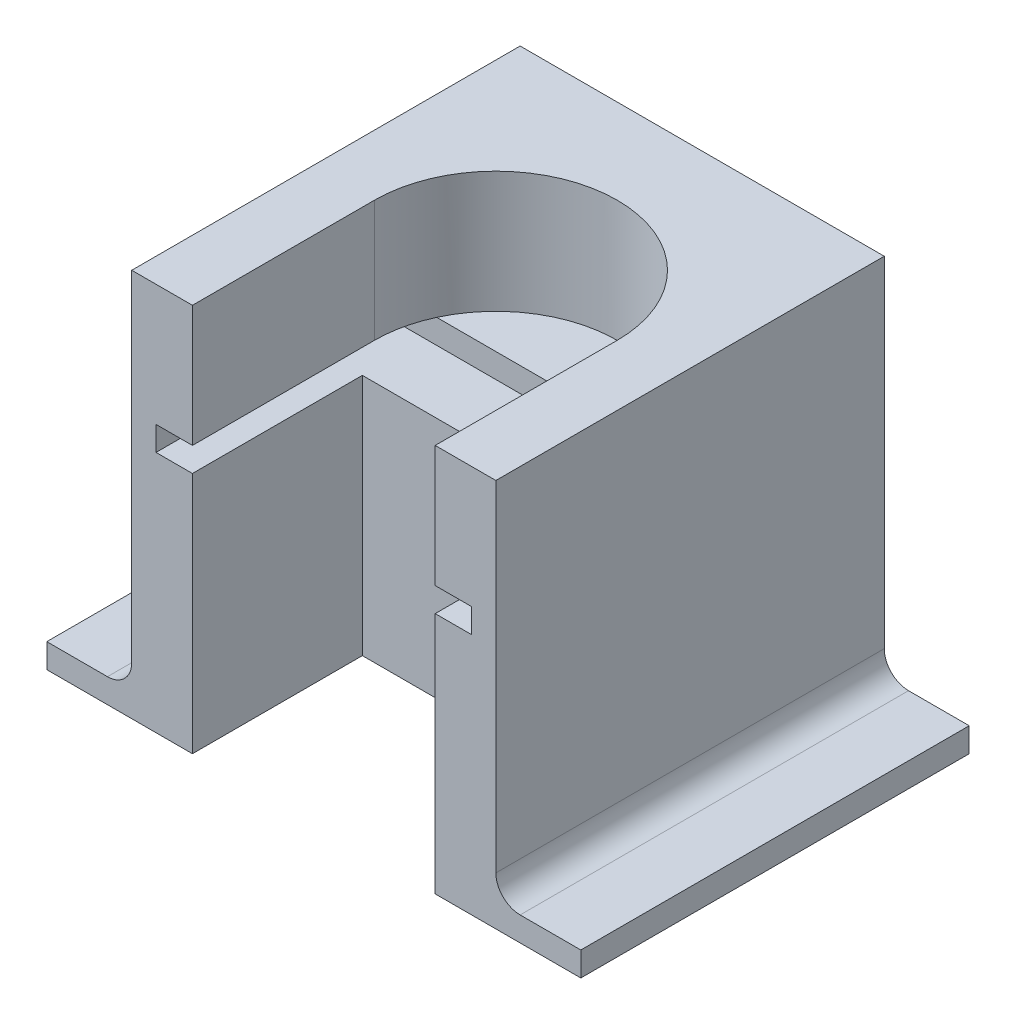
ISO-10303-21;
HEADER;
FILE_DESCRIPTION(('STEP AP214'),'2;1');
FILE_NAME('part.step','',(''),(''),'','','');
FILE_SCHEMA(('AUTOMOTIVE_DESIGN { 1 0 10303 214 1 1 1 1 }'));
ENDSEC;
DATA;
#1=APPLICATION_CONTEXT('core data for automotive mechanical design processes');
#2=APPLICATION_PROTOCOL_DEFINITION('international standard','automotive_design',2000,#1);
#3=PRODUCT_CONTEXT('',#1,'mechanical');
#4=PRODUCT('Part','Part','',(#3));
#5=PRODUCT_RELATED_PRODUCT_CATEGORY('part','',(#4));
#6=PRODUCT_DEFINITION_FORMATION('','',#4);
#7=PRODUCT_DEFINITION_CONTEXT('part definition',#1,'design');
#8=PRODUCT_DEFINITION('design','',#6,#7);
#9=PRODUCT_DEFINITION_SHAPE('','',#8);
#10=(LENGTH_UNIT() NAMED_UNIT(*) SI_UNIT(.MILLI.,.METRE.));
#11=(NAMED_UNIT(*) PLANE_ANGLE_UNIT() SI_UNIT($,.RADIAN.));
#12=(NAMED_UNIT(*) SI_UNIT($,.STERADIAN.) SOLID_ANGLE_UNIT());
#13=UNCERTAINTY_MEASURE_WITH_UNIT(LENGTH_MEASURE(1.E-05),#10,'distance_accuracy_value','');
#14=(GEOMETRIC_REPRESENTATION_CONTEXT(3) GLOBAL_UNCERTAINTY_ASSIGNED_CONTEXT((#13)) GLOBAL_UNIT_ASSIGNED_CONTEXT((#10,
#11,#12)) REPRESENTATION_CONTEXT('',''));
#15=CARTESIAN_POINT('',(0.,0.,0.));
#16=DIRECTION('',(0.,0.,1.));
#17=DIRECTION('',(1.,0.,0.));
#18=AXIS2_PLACEMENT_3D('',#15,#16,#17);
#19=CARTESIAN_POINT('',(-4.99999999999999,22.,-28.));
#20=DIRECTION('',(0.,1.,0.));
#21=DIRECTION('',(0.,0.,1.));
#22=AXIS2_PLACEMENT_3D('',#19,#20,#21);
#23=PLANE('',#22);
#24=DIRECTION('',(0.,0.,1.));
#25=VECTOR('',#24,1.);
#26=CARTESIAN_POINT('',(-28.,22.,-28.));
#27=LINE('',#26,#25);
#28=CARTESIAN_POINT('',(-28.,22.,-19.2));
#29=VERTEX_POINT('',#28);
#30=CARTESIAN_POINT('',(-28.,22.,0.));
#31=VERTEX_POINT('',#30);
#32=EDGE_CURVE('E319',#29,#31,#27,.T.);
#33=ORIENTED_EDGE('',*,*,#32,.F.);
#34=DIRECTION('',(1.,0.,0.));
#35=VECTOR('',#34,1.);
#36=CARTESIAN_POINT('',(-1.99999999999999,22.,-19.2));
#37=LINE('',#36,#35);
#38=CARTESIAN_POINT('',(-24.0752410436307,22.,-19.2));
#39=VERTEX_POINT('',#38);
#40=EDGE_CURVE('E235',#29,#39,#37,.T.);
#41=ORIENTED_EDGE('',*,*,#40,.T.);
#42=CARTESIAN_POINT('',(-15.,22.,-15.));
#43=DIRECTION('',(0.,1.,0.));
#44=DIRECTION('',(0.,0.,1.));
#45=AXIS2_PLACEMENT_3D('',#42,#43,#44);
#46=CIRCLE('',#45,9.99999999999999);
#47=CARTESIAN_POINT('',(-25.,22.,-15.));
#48=VERTEX_POINT('',#47);
#49=EDGE_CURVE('E247',#39,#48,#46,.T.);
#50=ORIENTED_EDGE('',*,*,#49,.T.);
#51=DIRECTION('',(0.,0.,1.));
#52=VECTOR('',#51,1.);
#53=CARTESIAN_POINT('',(-25.,22.,-28.));
#54=LINE('',#53,#52);
#55=CARTESIAN_POINT('',(-25.,22.,0.));
#56=VERTEX_POINT('',#55);
#57=EDGE_CURVE('E317',#48,#56,#54,.T.);
#58=ORIENTED_EDGE('',*,*,#57,.T.);
#59=DIRECTION('',(-1.,0.,0.));
#60=VECTOR('',#59,1.);
#61=CARTESIAN_POINT('',(-25.,22.,0.));
#62=LINE('',#61,#60);
#63=EDGE_CURVE('E291',#56,#31,#62,.T.);
#64=ORIENTED_EDGE('',*,*,#63,.T.);
#65=EDGE_LOOP('',(#33,#41,#50,#58,#64));
#66=FACE_BOUND('',#65,.T.);
#67=ADVANCED_FACE('F32',(#66),#23,.F.);
#68=CARTESIAN_POINT('',(-25.,32.,-28.));
#69=DIRECTION('',(-1.,0.,0.));
#70=DIRECTION('',(0.,0.,1.));
#71=AXIS2_PLACEMENT_3D('',#68,#69,#70);
#72=PLANE('',#71);
#73=DIRECTION('',(0.,1.,0.));
#74=VECTOR('',#73,1.);
#75=CARTESIAN_POINT('',(-25.,-1.85372088375312,-15.));
#76=LINE('',#75,#74);
#77=CARTESIAN_POINT('',(-25.,32.,-15.));
#78=VERTEX_POINT('',#77);
#79=EDGE_CURVE('E250',#48,#78,#76,.T.);
#80=ORIENTED_EDGE('',*,*,#79,.T.);
#81=DIRECTION('',(0.,0.,-1.));
#82=VECTOR('',#81,1.);
#83=CARTESIAN_POINT('',(-25.,32.,-28.));
#84=LINE('',#83,#82);
#85=CARTESIAN_POINT('',(-25.,32.,0.));
#86=VERTEX_POINT('',#85);
#87=EDGE_CURVE('E325',#86,#78,#84,.T.);
#88=ORIENTED_EDGE('',*,*,#87,.F.);
#89=DIRECTION('',(0.,-1.,0.));
#90=VECTOR('',#89,1.);
#91=CARTESIAN_POINT('',(-25.,32.,0.));
#92=LINE('',#91,#90);
#93=EDGE_CURVE('E328',#86,#56,#92,.T.);
#94=ORIENTED_EDGE('',*,*,#93,.T.);
#95=ORIENTED_EDGE('',*,*,#57,.F.);
#96=EDGE_LOOP('',(#80,#88,#94,#95));
#97=FACE_BOUND('',#96,.T.);
#98=ADVANCED_FACE('F447',(#97),#72,.F.);
#99=CARTESIAN_POINT('',(-30.,20.,0.));
#100=DIRECTION('',(1.,0.,0.));
#101=DIRECTION('',(0.,0.,-1.));
#102=AXIS2_PLACEMENT_3D('',#99,#100,#101);
#103=PLANE('',#102);
#104=DIRECTION('',(0.,0.,1.));
#105=VECTOR('',#104,1.);
#106=CARTESIAN_POINT('',(-30.,32.,-28.));
#107=LINE('',#106,#105);
#108=CARTESIAN_POINT('',(-30.,32.,-32.));
#109=VERTEX_POINT('',#108);
#110=CARTESIAN_POINT('',(-30.,32.,0.));
#111=VERTEX_POINT('',#110);
#112=EDGE_CURVE('E200',#109,#111,#107,.T.);
#113=ORIENTED_EDGE('',*,*,#112,.F.);
#114=DIRECTION('',(0.,1.,0.));
#115=VECTOR('',#114,1.);
#116=CARTESIAN_POINT('',(-30.,4.,-32.));
#117=LINE('',#116,#115);
#118=CARTESIAN_POINT('',(-30.,4.,-32.));
#119=VERTEX_POINT('',#118);
#120=EDGE_CURVE('E197',#119,#109,#117,.T.);
#121=ORIENTED_EDGE('',*,*,#120,.F.);
#122=DIRECTION('',(0.,0.,-1.));
#123=VECTOR('',#122,1.);
#124=CARTESIAN_POINT('',(-30.,4.,0.));
#125=LINE('',#124,#123);
#126=CARTESIAN_POINT('',(-30.,4.,0.));
#127=VERTEX_POINT('',#126);
#128=EDGE_CURVE('E187',#119,#127,#125,.F.);
#129=ORIENTED_EDGE('',*,*,#128,.T.);
#130=DIRECTION('',(0.,-1.,0.));
#131=VECTOR('',#130,1.);
#132=CARTESIAN_POINT('',(-30.,20.,0.));
#133=LINE('',#132,#131);
#134=EDGE_CURVE('E352',#111,#127,#133,.T.);
#135=ORIENTED_EDGE('',*,*,#134,.F.);
#136=EDGE_LOOP('',(#113,#121,#129,#135));
#137=FACE_BOUND('',#136,.T.);
#138=ADVANCED_FACE('F198',(#137),#103,.F.);
#139=CARTESIAN_POINT('',(0.,20.,0.));
#140=DIRECTION('',(0.,0.,-1.));
#141=DIRECTION('',(-1.,0.,0.));
#142=AXIS2_PLACEMENT_3D('',#139,#140,#141);
#143=PLANE('',#142);
#144=DIRECTION('',(1.,0.,0.));
#145=VECTOR('',#144,1.);
#146=CARTESIAN_POINT('',(0.,20.,0.));
#147=LINE('',#146,#145);
#148=CARTESIAN_POINT('',(-4.99999999999999,20.,0.));
#149=VERTEX_POINT('',#148);
#150=CARTESIAN_POINT('',(-1.99999999999999,20.,0.));
#151=VERTEX_POINT('',#150);
#152=EDGE_CURVE('E346',#149,#151,#147,.T.);
#153=ORIENTED_EDGE('',*,*,#152,.F.);
#154=DIRECTION('',(0.,1.,0.));
#155=VECTOR('',#154,1.);
#156=CARTESIAN_POINT('',(-4.99999999999999,20.,0.));
#157=LINE('',#156,#155);
#158=CARTESIAN_POINT('',(-4.99999999999999,0.,0.));
#159=VERTEX_POINT('',#158);
#160=EDGE_CURVE('E271',#159,#149,#157,.T.);
#161=ORIENTED_EDGE('',*,*,#160,.F.);
#162=DIRECTION('',(1.,0.,0.));
#163=VECTOR('',#162,1.);
#164=CARTESIAN_POINT('',(0.,0.,0.));
#165=LINE('',#164,#163);
#166=CARTESIAN_POINT('',(7.,0.,0.));
#167=VERTEX_POINT('',#166);
#168=EDGE_CURVE('E341',#159,#167,#165,.T.);
#169=ORIENTED_EDGE('',*,*,#168,.T.);
#170=DIRECTION('',(0.,1.,0.));
#171=VECTOR('',#170,1.);
#172=CARTESIAN_POINT('',(7.,0.,0.));
#173=LINE('',#172,#171);
#174=CARTESIAN_POINT('',(7.,1.99999999999999,0.));
#175=VERTEX_POINT('',#174);
#176=EDGE_CURVE('E256',#167,#175,#173,.T.);
#177=ORIENTED_EDGE('',*,*,#176,.T.);
#178=DIRECTION('',(-1.,0.,0.));
#179=VECTOR('',#178,1.);
#180=CARTESIAN_POINT('',(0.,2.,0.));
#181=LINE('',#180,#179);
#182=CARTESIAN_POINT('',(2.,2.,0.));
#183=VERTEX_POINT('',#182);
#184=EDGE_CURVE('E258',#175,#183,#181,.T.);
#185=ORIENTED_EDGE('',*,*,#184,.T.);
#186=CARTESIAN_POINT('',(2.,4.,0.));
#187=DIRECTION('',(0.,0.,-1.));
#188=DIRECTION('',(-1.,0.,0.));
#189=AXIS2_PLACEMENT_3D('',#186,#187,#188);
#190=CIRCLE('',#189,2.);
#191=CARTESIAN_POINT('',(0.,4.,0.));
#192=VERTEX_POINT('',#191);
#193=EDGE_CURVE('E40',#183,#192,#190,.T.);
#194=ORIENTED_EDGE('',*,*,#193,.T.);
#195=DIRECTION('',(0.,-1.,0.));
#196=VECTOR('',#195,1.);
#197=CARTESIAN_POINT('',(0.,20.,0.));
#198=LINE('',#197,#196);
#199=CARTESIAN_POINT('',(0.,32.,0.));
#200=VERTEX_POINT('',#199);
#201=EDGE_CURVE('E345',#200,#192,#198,.T.);
#202=ORIENTED_EDGE('',*,*,#201,.F.);
#203=DIRECTION('',(1.,0.,0.));
#204=VECTOR('',#203,1.);
#205=CARTESIAN_POINT('',(0.,32.,0.));
#206=LINE('',#205,#204);
#207=CARTESIAN_POINT('',(-4.99999999999999,32.,0.));
#208=VERTEX_POINT('',#207);
#209=EDGE_CURVE('E335',#208,#200,#206,.T.);
#210=ORIENTED_EDGE('',*,*,#209,.F.);
#211=DIRECTION('',(0.,-1.,0.));
#212=VECTOR('',#211,1.);
#213=CARTESIAN_POINT('',(-4.99999999999999,32.,0.));
#214=LINE('',#213,#212);
#215=CARTESIAN_POINT('',(-4.99999999999999,22.,0.));
#216=VERTEX_POINT('',#215);
#217=EDGE_CURVE('E338',#208,#216,#214,.T.);
#218=ORIENTED_EDGE('',*,*,#217,.T.);
#219=DIRECTION('',(-1.,0.,0.));
#220=VECTOR('',#219,1.);
#221=CARTESIAN_POINT('',(-4.99999999999999,22.,0.));
#222=LINE('',#221,#220);
#223=CARTESIAN_POINT('',(-1.99999999999999,22.,0.));
#224=VERTEX_POINT('',#223);
#225=EDGE_CURVE('E302',#224,#216,#222,.T.);
#226=ORIENTED_EDGE('',*,*,#225,.F.);
#227=DIRECTION('',(0.,1.,0.));
#228=VECTOR('',#227,1.);
#229=CARTESIAN_POINT('',(-1.99999999999999,20.,0.));
#230=LINE('',#229,#228);
#231=EDGE_CURVE('E299',#151,#224,#230,.T.);
#232=ORIENTED_EDGE('',*,*,#231,.F.);
#233=EDGE_LOOP('',(#153,#161,#169,#177,#185,#194,#202,#210,#218,#226,#232));
#234=FACE_BOUND('',#233,.T.);
#235=ADVANCED_FACE('F361',(#234),#143,.F.);
#236=CARTESIAN_POINT('',(0.,20.,0.));
#237=DIRECTION('',(0.,1.,0.));
#238=DIRECTION('',(0.,0.,1.));
#239=AXIS2_PLACEMENT_3D('',#236,#237,#238);
#240=PLANE('',#239);
#241=DIRECTION('',(-1.,0.,0.));
#242=VECTOR('',#241,1.);
#243=CARTESIAN_POINT('',(-1.99999999999999,20.,-19.2));
#244=LINE('',#243,#242);
#245=CARTESIAN_POINT('',(-1.99999999999999,20.,-19.2));
#246=VERTEX_POINT('',#245);
#247=CARTESIAN_POINT('',(-28.,20.,-19.2));
#248=VERTEX_POINT('',#247);
#249=EDGE_CURVE('E47',#246,#248,#244,.T.);
#250=ORIENTED_EDGE('',*,*,#249,.T.);
#251=DIRECTION('',(0.,0.,1.));
#252=VECTOR('',#251,1.);
#253=CARTESIAN_POINT('',(-28.,20.,-28.));
#254=LINE('',#253,#252);
#255=CARTESIAN_POINT('',(-28.,20.,0.));
#256=VERTEX_POINT('',#255);
#257=EDGE_CURVE('E303',#248,#256,#254,.T.);
#258=ORIENTED_EDGE('',*,*,#257,.T.);
#259=CARTESIAN_POINT('',(-25.,20.,0.));
#260=VERTEX_POINT('',#259);
#261=EDGE_CURVE('E342',#256,#260,#147,.T.);
#262=ORIENTED_EDGE('',*,*,#261,.T.);
#263=DIRECTION('',(0.,0.,1.));
#264=VECTOR('',#263,1.);
#265=CARTESIAN_POINT('',(-25.,20.,-14.));
#266=LINE('',#265,#264);
#267=CARTESIAN_POINT('',(-25.,20.,-14.));
#268=VERTEX_POINT('',#267);
#269=EDGE_CURVE('E295',#268,#260,#266,.T.);
#270=ORIENTED_EDGE('',*,*,#269,.F.);
#271=DIRECTION('',(-1.,0.,0.));
#272=VECTOR('',#271,1.);
#273=CARTESIAN_POINT('',(-4.99999999999999,20.,-14.));
#274=LINE('',#273,#272);
#275=CARTESIAN_POINT('',(-4.99999999999999,20.,-14.));
#276=VERTEX_POINT('',#275);
#277=EDGE_CURVE('E277',#276,#268,#274,.T.);
#278=ORIENTED_EDGE('',*,*,#277,.F.);
#279=DIRECTION('',(0.,0.,1.));
#280=VECTOR('',#279,1.);
#281=CARTESIAN_POINT('',(-4.99999999999999,20.,-14.));
#282=LINE('',#281,#280);
#283=EDGE_CURVE('E286',#276,#149,#282,.T.);
#284=ORIENTED_EDGE('',*,*,#283,.T.);
#285=ORIENTED_EDGE('',*,*,#152,.T.);
#286=DIRECTION('',(0.,0.,1.));
#287=VECTOR('',#286,1.);
#288=CARTESIAN_POINT('',(-1.99999999999999,20.,-28.));
#289=LINE('',#288,#287);
#290=EDGE_CURVE('E306',#246,#151,#289,.T.);
#291=ORIENTED_EDGE('',*,*,#290,.F.);
#292=EDGE_LOOP('',(#250,#258,#262,#270,#278,#284,#285,#291));
#293=FACE_BOUND('',#292,.T.);
#294=ADVANCED_FACE('F418',(#293),#240,.T.);
#295=CARTESIAN_POINT('',(0.,20.,0.));
#296=DIRECTION('',(-1.,0.,0.));
#297=DIRECTION('',(0.,0.,1.));
#298=AXIS2_PLACEMENT_3D('',#295,#296,#297);
#299=PLANE('',#298);
#300=ORIENTED_EDGE('',*,*,#201,.T.);
#301=DIRECTION('',(0.,0.,-1.));
#302=VECTOR('',#301,1.);
#303=CARTESIAN_POINT('',(0.,4.,0.));
#304=LINE('',#303,#302);
#305=CARTESIAN_POINT('',(0.,4.,-32.));
#306=VERTEX_POINT('',#305);
#307=EDGE_CURVE('E354',#192,#306,#304,.T.);
#308=ORIENTED_EDGE('',*,*,#307,.T.);
#309=DIRECTION('',(0.,-1.,0.));
#310=VECTOR('',#309,1.);
#311=CARTESIAN_POINT('',(0.,32.,-32.));
#312=LINE('',#311,#310);
#313=CARTESIAN_POINT('',(0.,32.,-32.));
#314=VERTEX_POINT('',#313);
#315=EDGE_CURVE('E214',#314,#306,#312,.T.);
#316=ORIENTED_EDGE('',*,*,#315,.F.);
#317=DIRECTION('',(0.,0.,-1.));
#318=VECTOR('',#317,1.);
#319=CARTESIAN_POINT('',(0.,32.,-28.));
#320=LINE('',#319,#318);
#321=EDGE_CURVE('E331',#200,#314,#320,.T.);
#322=ORIENTED_EDGE('',*,*,#321,.F.);
#323=EDGE_LOOP('',(#300,#308,#316,#322));
#324=FACE_BOUND('',#323,.T.);
#325=ADVANCED_FACE('F368',(#324),#299,.F.);
#326=CARTESIAN_POINT('',(-37.,0.,0.));
#327=VERTEX_POINT('',#326);
#328=CARTESIAN_POINT('',(-25.,0.,0.));
#329=VERTEX_POINT('',#328);
#330=EDGE_CURVE('E347',#327,#329,#165,.T.);
#331=ORIENTED_EDGE('',*,*,#330,.T.);
#332=DIRECTION('',(0.,-1.,0.));
#333=VECTOR('',#332,1.);
#334=CARTESIAN_POINT('',(-25.,20.,0.));
#335=LINE('',#334,#333);
#336=EDGE_CURVE('E278',#260,#329,#335,.T.);
#337=ORIENTED_EDGE('',*,*,#336,.F.);
#338=ORIENTED_EDGE('',*,*,#261,.F.);
#339=DIRECTION('',(0.,-1.,0.));
#340=VECTOR('',#339,1.);
#341=CARTESIAN_POINT('',(-28.,20.,0.));
#342=LINE('',#341,#340);
#343=EDGE_CURVE('E314',#31,#256,#342,.T.);
#344=ORIENTED_EDGE('',*,*,#343,.F.);
#345=ORIENTED_EDGE('',*,*,#63,.F.);
#346=ORIENTED_EDGE('',*,*,#93,.F.);
#347=DIRECTION('',(1.,0.,0.));
#348=VECTOR('',#347,1.);
#349=CARTESIAN_POINT('',(-30.,32.,0.));
#350=LINE('',#349,#348);
#351=EDGE_CURVE('E323',#111,#86,#350,.T.);
#352=ORIENTED_EDGE('',*,*,#351,.F.);
#353=ORIENTED_EDGE('',*,*,#134,.T.);
#354=CARTESIAN_POINT('',(-32.,4.,0.));
#355=DIRECTION('',(0.,0.,-1.));
#356=DIRECTION('',(-1.,0.,0.));
#357=AXIS2_PLACEMENT_3D('',#354,#355,#356);
#358=CIRCLE('',#357,2.);
#359=CARTESIAN_POINT('',(-32.,2.,0.));
#360=VERTEX_POINT('',#359);
#361=EDGE_CURVE('E11',#127,#360,#358,.T.);
#362=ORIENTED_EDGE('',*,*,#361,.T.);
#363=DIRECTION('',(-1.,0.,0.));
#364=VECTOR('',#363,1.);
#365=CARTESIAN_POINT('',(-30.,2.,0.));
#366=LINE('',#365,#364);
#367=CARTESIAN_POINT('',(-37.,2.,0.));
#368=VERTEX_POINT('',#367);
#369=EDGE_CURVE('E268',#360,#368,#366,.T.);
#370=ORIENTED_EDGE('',*,*,#369,.T.);
#371=DIRECTION('',(0.,-1.,0.));
#372=VECTOR('',#371,1.);
#373=CARTESIAN_POINT('',(-37.,0.,0.));
#374=LINE('',#373,#372);
#375=EDGE_CURVE('E265',#368,#327,#374,.T.);
#376=ORIENTED_EDGE('',*,*,#375,.T.);
#377=EDGE_LOOP('',(#331,#337,#338,#344,#345,#346,#352,#353,#362,#370,#376));
#378=FACE_BOUND('',#377,.T.);
#379=ADVANCED_FACE('F395',(#378),#143,.F.);
#380=CARTESIAN_POINT('',(0.,0.,0.));
#381=DIRECTION('',(0.,1.,0.));
#382=DIRECTION('',(0.,0.,1.));
#383=AXIS2_PLACEMENT_3D('',#380,#381,#382);
#384=PLANE('',#383);
#385=ORIENTED_EDGE('',*,*,#168,.F.);
#386=DIRECTION('',(0.,0.,1.));
#387=VECTOR('',#386,1.);
#388=CARTESIAN_POINT('',(-4.99999999999999,0.,-14.));
#389=LINE('',#388,#387);
#390=CARTESIAN_POINT('',(-4.99999999999999,0.,-14.));
#391=VERTEX_POINT('',#390);
#392=EDGE_CURVE('E289',#391,#159,#389,.T.);
#393=ORIENTED_EDGE('',*,*,#392,.F.);
#394=DIRECTION('',(1.,0.,0.));
#395=VECTOR('',#394,1.);
#396=CARTESIAN_POINT('',(-4.99999999999999,0.,-14.));
#397=LINE('',#396,#395);
#398=CARTESIAN_POINT('',(-25.,0.,-14.));
#399=VERTEX_POINT('',#398);
#400=EDGE_CURVE('E283',#399,#391,#397,.T.);
#401=ORIENTED_EDGE('',*,*,#400,.F.);
#402=DIRECTION('',(0.,0.,1.));
#403=VECTOR('',#402,1.);
#404=CARTESIAN_POINT('',(-25.,0.,-14.));
#405=LINE('',#404,#403);
#406=EDGE_CURVE('E292',#399,#329,#405,.T.);
#407=ORIENTED_EDGE('',*,*,#406,.T.);
#408=ORIENTED_EDGE('',*,*,#330,.F.);
#409=DIRECTION('',(0.,0.,-1.));
#410=VECTOR('',#409,1.);
#411=CARTESIAN_POINT('',(-37.,0.,7.28010988928053));
#412=LINE('',#411,#410);
#413=CARTESIAN_POINT('',(-37.,0.,-32.));
#414=VERTEX_POINT('',#413);
#415=EDGE_CURVE('E264',#327,#414,#412,.T.);
#416=ORIENTED_EDGE('',*,*,#415,.T.);
#417=DIRECTION('',(-1.,0.,0.));
#418=VECTOR('',#417,1.);
#419=CARTESIAN_POINT('',(6.99999999999999,0.,-32.));
#420=LINE('',#419,#418);
#421=CARTESIAN_POINT('',(6.99999999999999,0.,-32.));
#422=VERTEX_POINT('',#421);
#423=EDGE_CURVE('E226',#422,#414,#420,.T.);
#424=ORIENTED_EDGE('',*,*,#423,.F.);
#425=DIRECTION('',(0.,0.,-1.));
#426=VECTOR('',#425,1.);
#427=CARTESIAN_POINT('',(7.,0.,7.28010988928052));
#428=LINE('',#427,#426);
#429=EDGE_CURVE('E259',#167,#422,#428,.T.);
#430=ORIENTED_EDGE('',*,*,#429,.F.);
#431=EDGE_LOOP('',(#385,#393,#401,#407,#408,#416,#424,#430));
#432=FACE_BOUND('',#431,.T.);
#433=ADVANCED_FACE('F385',(#432),#384,.F.);
#434=CARTESIAN_POINT('',(-5.,32.,-28.));
#435=DIRECTION('',(1.,0.,0.));
#436=DIRECTION('',(0.,0.,-1.));
#437=AXIS2_PLACEMENT_3D('',#434,#435,#436);
#438=PLANE('',#437);
#439=DIRECTION('',(0.,0.,1.));
#440=VECTOR('',#439,1.);
#441=CARTESIAN_POINT('',(-5.,32.,-28.));
#442=LINE('',#441,#440);
#443=CARTESIAN_POINT('',(-5.,32.,-15.));
#444=VERTEX_POINT('',#443);
#445=EDGE_CURVE('E333',#444,#208,#442,.T.);
#446=ORIENTED_EDGE('',*,*,#445,.F.);
#447=DIRECTION('',(0.,1.,0.));
#448=VECTOR('',#447,1.);
#449=CARTESIAN_POINT('',(-5.,-1.85372088375312,-15.));
#450=LINE('',#449,#448);
#451=CARTESIAN_POINT('',(-5.,22.,-15.));
#452=VERTEX_POINT('',#451);
#453=EDGE_CURVE('E251',#452,#444,#450,.T.);
#454=ORIENTED_EDGE('',*,*,#453,.F.);
#455=DIRECTION('',(0.,0.,1.));
#456=VECTOR('',#455,1.);
#457=CARTESIAN_POINT('',(-4.99999999999999,22.,-28.));
#458=LINE('',#457,#456);
#459=EDGE_CURVE('E307',#452,#216,#458,.T.);
#460=ORIENTED_EDGE('',*,*,#459,.T.);
#461=ORIENTED_EDGE('',*,*,#217,.F.);
#462=EDGE_LOOP('',(#446,#454,#460,#461));
#463=FACE_BOUND('',#462,.T.);
#464=ADVANCED_FACE('F406',(#463),#438,.F.);
#465=CARTESIAN_POINT('',(0.,32.,0.));
#466=DIRECTION('',(0.,-1.,0.));
#467=DIRECTION('',(0.,0.,-1.));
#468=AXIS2_PLACEMENT_3D('',#465,#466,#467);
#469=PLANE('',#468);
#470=ORIENTED_EDGE('',*,*,#321,.T.);
#471=DIRECTION('',(1.,0.,0.));
#472=VECTOR('',#471,1.);
#473=CARTESIAN_POINT('',(-30.,32.,-32.));
#474=LINE('',#473,#472);
#475=EDGE_CURVE('E204',#109,#314,#474,.T.);
#476=ORIENTED_EDGE('',*,*,#475,.F.);
#477=ORIENTED_EDGE('',*,*,#112,.T.);
#478=ORIENTED_EDGE('',*,*,#351,.T.);
#479=ORIENTED_EDGE('',*,*,#87,.T.);
#480=CARTESIAN_POINT('',(-15.,32.,-15.));
#481=DIRECTION('',(0.,-1.,0.));
#482=DIRECTION('',(0.,0.,1.));
#483=AXIS2_PLACEMENT_3D('',#480,#481,#482);
#484=CIRCLE('',#483,9.99999999999999);
#485=EDGE_CURVE('E241',#78,#444,#484,.T.);
#486=ORIENTED_EDGE('',*,*,#485,.T.);
#487=ORIENTED_EDGE('',*,*,#445,.T.);
#488=ORIENTED_EDGE('',*,*,#209,.T.);
#489=EDGE_LOOP('',(#470,#476,#477,#478,#479,#486,#487,#488));
#490=FACE_BOUND('',#489,.T.);
#491=ADVANCED_FACE('F401',(#490),#469,.F.);
#492=CARTESIAN_POINT('',(-28.,20.,-28.));
#493=DIRECTION('',(-1.,0.,0.));
#494=DIRECTION('',(0.,-1.,0.));
#495=AXIS2_PLACEMENT_3D('',#492,#493,#494);
#496=PLANE('',#495);
#497=ORIENTED_EDGE('',*,*,#257,.F.);
#498=DIRECTION('',(0.,1.,0.));
#499=VECTOR('',#498,1.);
#500=CARTESIAN_POINT('',(-28.,22.,-19.2));
#501=LINE('',#500,#499);
#502=EDGE_CURVE('E54',#248,#29,#501,.T.);
#503=ORIENTED_EDGE('',*,*,#502,.T.);
#504=ORIENTED_EDGE('',*,*,#32,.T.);
#505=ORIENTED_EDGE('',*,*,#343,.T.);
#506=EDGE_LOOP('',(#497,#503,#504,#505));
#507=FACE_BOUND('',#506,.T.);
#508=ADVANCED_FACE('F432',(#507),#496,.F.);
#509=CARTESIAN_POINT('',(-5.92475895636926,22.,-19.2));
#510=VERTEX_POINT('',#509);
#511=EDGE_CURVE('E242',#452,#510,#46,.T.);
#512=ORIENTED_EDGE('',*,*,#511,.T.);
#513=CARTESIAN_POINT('',(-1.99999999999999,22.,-19.2));
#514=VERTEX_POINT('',#513);
#515=EDGE_CURVE('E234',#510,#514,#37,.T.);
#516=ORIENTED_EDGE('',*,*,#515,.T.);
#517=DIRECTION('',(0.,0.,1.));
#518=VECTOR('',#517,1.);
#519=CARTESIAN_POINT('',(-1.99999999999999,22.,-28.));
#520=LINE('',#519,#518);
#521=EDGE_CURVE('E309',#514,#224,#520,.T.);
#522=ORIENTED_EDGE('',*,*,#521,.T.);
#523=ORIENTED_EDGE('',*,*,#225,.T.);
#524=ORIENTED_EDGE('',*,*,#459,.F.);
#525=EDGE_LOOP('',(#512,#516,#522,#523,#524));
#526=FACE_BOUND('',#525,.T.);
#527=ADVANCED_FACE('F410',(#526),#23,.F.);
#528=CARTESIAN_POINT('',(-1.99999999999999,20.,-28.));
#529=DIRECTION('',(1.,0.,0.));
#530=DIRECTION('',(0.,0.,-1.));
#531=AXIS2_PLACEMENT_3D('',#528,#529,#530);
#532=PLANE('',#531);
#533=ORIENTED_EDGE('',*,*,#521,.F.);
#534=DIRECTION('',(0.,-1.,0.));
#535=VECTOR('',#534,1.);
#536=CARTESIAN_POINT('',(-1.99999999999999,20.,-19.2));
#537=LINE('',#536,#535);
#538=EDGE_CURVE('E238',#514,#246,#537,.T.);
#539=ORIENTED_EDGE('',*,*,#538,.T.);
#540=ORIENTED_EDGE('',*,*,#290,.T.);
#541=ORIENTED_EDGE('',*,*,#231,.T.);
#542=EDGE_LOOP('',(#533,#539,#540,#541));
#543=FACE_BOUND('',#542,.T.);
#544=ADVANCED_FACE('F415',(#543),#532,.F.);
#545=CARTESIAN_POINT('',(-4.99999999999999,20.,-14.));
#546=DIRECTION('',(1.,0.,0.));
#547=DIRECTION('',(0.,1.,0.));
#548=AXIS2_PLACEMENT_3D('',#545,#546,#547);
#549=PLANE('',#548);
#550=ORIENTED_EDGE('',*,*,#160,.T.);
#551=ORIENTED_EDGE('',*,*,#283,.F.);
#552=DIRECTION('',(0.,1.,0.));
#553=VECTOR('',#552,1.);
#554=CARTESIAN_POINT('',(-4.99999999999999,20.,-14.));
#555=LINE('',#554,#553);
#556=EDGE_CURVE('E274',#391,#276,#555,.T.);
#557=ORIENTED_EDGE('',*,*,#556,.F.);
#558=ORIENTED_EDGE('',*,*,#392,.T.);
#559=EDGE_LOOP('',(#550,#551,#557,#558));
#560=FACE_BOUND('',#559,.T.);
#561=ADVANCED_FACE('F422',(#560),#549,.F.);
#562=CARTESIAN_POINT('',(-25.,20.,-14.));
#563=DIRECTION('',(-1.,0.,0.));
#564=DIRECTION('',(0.,-1.,0.));
#565=AXIS2_PLACEMENT_3D('',#562,#563,#564);
#566=PLANE('',#565);
#567=ORIENTED_EDGE('',*,*,#336,.T.);
#568=ORIENTED_EDGE('',*,*,#406,.F.);
#569=DIRECTION('',(0.,-1.,0.));
#570=VECTOR('',#569,1.);
#571=CARTESIAN_POINT('',(-25.,20.,-14.));
#572=LINE('',#571,#570);
#573=EDGE_CURVE('E281',#268,#399,#572,.T.);
#574=ORIENTED_EDGE('',*,*,#573,.F.);
#575=ORIENTED_EDGE('',*,*,#269,.T.);
#576=EDGE_LOOP('',(#567,#568,#574,#575));
#577=FACE_BOUND('',#576,.T.);
#578=ADVANCED_FACE('F488',(#577),#566,.F.);
#579=CARTESIAN_POINT('',(0.,0.,-14.));
#580=DIRECTION('',(0.,0.,-1.));
#581=DIRECTION('',(-1.,0.,0.));
#582=AXIS2_PLACEMENT_3D('',#579,#580,#581);
#583=PLANE('',#582);
#584=ORIENTED_EDGE('',*,*,#556,.T.);
#585=ORIENTED_EDGE('',*,*,#277,.T.);
#586=ORIENTED_EDGE('',*,*,#573,.T.);
#587=ORIENTED_EDGE('',*,*,#400,.T.);
#588=EDGE_LOOP('',(#584,#585,#586,#587));
#589=FACE_BOUND('',#588,.T.);
#590=ADVANCED_FACE('F424',(#589),#583,.F.);
#591=CARTESIAN_POINT('',(-30.,2.,7.28010988928053));
#592=DIRECTION('',(0.,1.,0.));
#593=DIRECTION('',(0.,0.,1.));
#594=AXIS2_PLACEMENT_3D('',#591,#592,#593);
#595=PLANE('',#594);
#596=ORIENTED_EDGE('',*,*,#369,.F.);
#597=DIRECTION('',(0.,0.,-1.));
#598=VECTOR('',#597,1.);
#599=CARTESIAN_POINT('',(-32.,2.,7.28010988928053));
#600=LINE('',#599,#598);
#601=CARTESIAN_POINT('',(-32.,2.,-32.));
#602=VERTEX_POINT('',#601);
#603=EDGE_CURVE('E194',#360,#602,#600,.T.);
#604=ORIENTED_EDGE('',*,*,#603,.T.);
#605=DIRECTION('',(1.,0.,0.));
#606=VECTOR('',#605,1.);
#607=CARTESIAN_POINT('',(-37.,2.,-32.));
#608=LINE('',#607,#606);
#609=CARTESIAN_POINT('',(-37.,2.,-32.));
#610=VERTEX_POINT('',#609);
#611=EDGE_CURVE('E210',#610,#602,#608,.T.);
#612=ORIENTED_EDGE('',*,*,#611,.F.);
#613=DIRECTION('',(0.,0.,-1.));
#614=VECTOR('',#613,1.);
#615=CARTESIAN_POINT('',(-37.,2.,7.28010988928053));
#616=LINE('',#615,#614);
#617=EDGE_CURVE('E269',#368,#610,#616,.T.);
#618=ORIENTED_EDGE('',*,*,#617,.F.);
#619=EDGE_LOOP('',(#596,#604,#612,#618));
#620=FACE_BOUND('',#619,.T.);
#621=ADVANCED_FACE('F393',(#620),#595,.T.);
#622=CARTESIAN_POINT('',(-37.,0.,7.28010988928053));
#623=DIRECTION('',(-1.,0.,0.));
#624=DIRECTION('',(0.,0.,1.));
#625=AXIS2_PLACEMENT_3D('',#622,#623,#624);
#626=PLANE('',#625);
#627=ORIENTED_EDGE('',*,*,#375,.F.);
#628=ORIENTED_EDGE('',*,*,#617,.T.);
#629=DIRECTION('',(0.,1.,0.));
#630=VECTOR('',#629,1.);
#631=CARTESIAN_POINT('',(-37.,0.,-32.));
#632=LINE('',#631,#630);
#633=EDGE_CURVE('E229',#414,#610,#632,.T.);
#634=ORIENTED_EDGE('',*,*,#633,.F.);
#635=ORIENTED_EDGE('',*,*,#415,.F.);
#636=EDGE_LOOP('',(#627,#628,#634,#635));
#637=FACE_BOUND('',#636,.T.);
#638=ADVANCED_FACE('F389',(#637),#626,.T.);
#639=CARTESIAN_POINT('',(7.,0.,7.28010988928052));
#640=DIRECTION('',(1.,0.,0.));
#641=DIRECTION('',(0.,0.,-1.));
#642=AXIS2_PLACEMENT_3D('',#639,#640,#641);
#643=PLANE('',#642);
#644=ORIENTED_EDGE('',*,*,#176,.F.);
#645=ORIENTED_EDGE('',*,*,#429,.T.);
#646=DIRECTION('',(0.,-1.,0.));
#647=VECTOR('',#646,1.);
#648=CARTESIAN_POINT('',(6.99999999999999,1.99999999999999,-32.));
#649=LINE('',#648,#647);
#650=CARTESIAN_POINT('',(6.99999999999999,1.99999999999999,-32.));
#651=VERTEX_POINT('',#650);
#652=EDGE_CURVE('E223',#651,#422,#649,.T.);
#653=ORIENTED_EDGE('',*,*,#652,.F.);
#654=DIRECTION('',(0.,0.,-1.));
#655=VECTOR('',#654,1.);
#656=CARTESIAN_POINT('',(7.,1.99999999999999,7.28010988928052));
#657=LINE('',#656,#655);
#658=EDGE_CURVE('E245',#175,#651,#657,.T.);
#659=ORIENTED_EDGE('',*,*,#658,.F.);
#660=EDGE_LOOP('',(#644,#645,#653,#659));
#661=FACE_BOUND('',#660,.T.);
#662=ADVANCED_FACE('F379',(#661),#643,.T.);
#663=CARTESIAN_POINT('',(0.,2.,7.28010988928052));
#664=DIRECTION('',(0.,1.,0.));
#665=DIRECTION('',(-1.,0.,0.));
#666=AXIS2_PLACEMENT_3D('',#663,#664,#665);
#667=PLANE('',#666);
#668=ORIENTED_EDGE('',*,*,#658,.T.);
#669=DIRECTION('',(1.,0.,0.));
#670=VECTOR('',#669,1.);
#671=CARTESIAN_POINT('',(2.,2.,-32.));
#672=LINE('',#671,#670);
#673=CARTESIAN_POINT('',(2.,2.,-32.));
#674=VERTEX_POINT('',#673);
#675=EDGE_CURVE('E220',#674,#651,#672,.T.);
#676=ORIENTED_EDGE('',*,*,#675,.F.);
#677=DIRECTION('',(0.,0.,-1.));
#678=VECTOR('',#677,1.);
#679=CARTESIAN_POINT('',(2.,2.,7.28010988928052));
#680=LINE('',#679,#678);
#681=EDGE_CURVE('E356',#674,#183,#680,.F.);
#682=ORIENTED_EDGE('',*,*,#681,.T.);
#683=ORIENTED_EDGE('',*,*,#184,.F.);
#684=EDGE_LOOP('',(#668,#676,#682,#683));
#685=FACE_BOUND('',#684,.T.);
#686=ADVANCED_FACE('F375',(#685),#667,.T.);
#687=CARTESIAN_POINT('',(2.,4.,0.));
#688=DIRECTION('',(0.,0.,-1.));
#689=DIRECTION('',(-1.,0.,0.));
#690=AXIS2_PLACEMENT_3D('',#687,#688,#689);
#691=CYLINDRICAL_SURFACE('',#690,2.);
#692=ORIENTED_EDGE('',*,*,#193,.F.);
#693=ORIENTED_EDGE('',*,*,#681,.F.);
#694=CARTESIAN_POINT('',(2.,4.,-32.));
#695=DIRECTION('',(0.,0.,1.));
#696=DIRECTION('',(-1.,0.,0.));
#697=AXIS2_PLACEMENT_3D('',#694,#695,#696);
#698=CIRCLE('',#697,2.);
#699=EDGE_CURVE('E217',#306,#674,#698,.T.);
#700=ORIENTED_EDGE('',*,*,#699,.F.);
#701=ORIENTED_EDGE('',*,*,#307,.F.);
#702=EDGE_LOOP('',(#692,#693,#700,#701));
#703=FACE_BOUND('',#702,.T.);
#704=ADVANCED_FACE('F371',(#703),#691,.F.);
#705=CARTESIAN_POINT('',(-32.,4.,7.28010988928053));
#706=DIRECTION('',(0.,0.,-1.));
#707=DIRECTION('',(-1.,0.,0.));
#708=AXIS2_PLACEMENT_3D('',#705,#706,#707);
#709=CYLINDRICAL_SURFACE('',#708,2.);
#710=ORIENTED_EDGE('',*,*,#361,.F.);
#711=ORIENTED_EDGE('',*,*,#128,.F.);
#712=CARTESIAN_POINT('',(-32.,4.,-32.));
#713=DIRECTION('',(0.,0.,1.));
#714=DIRECTION('',(-1.,0.,0.));
#715=AXIS2_PLACEMENT_3D('',#712,#713,#714);
#716=CIRCLE('',#715,2.);
#717=EDGE_CURVE('E191',#602,#119,#716,.T.);
#718=ORIENTED_EDGE('',*,*,#717,.F.);
#719=ORIENTED_EDGE('',*,*,#603,.F.);
#720=EDGE_LOOP('',(#710,#711,#718,#719));
#721=FACE_BOUND('',#720,.T.);
#722=ADVANCED_FACE('F34',(#721),#709,.F.);
#723=CARTESIAN_POINT('',(-15.,-1.85372088375312,-15.));
#724=DIRECTION('',(0.,1.,0.));
#725=DIRECTION('',(0.,0.,1.));
#726=AXIS2_PLACEMENT_3D('',#723,#724,#725);
#727=CYLINDRICAL_SURFACE('',#726,9.99999999999999);
#728=ORIENTED_EDGE('',*,*,#511,.F.);
#729=ORIENTED_EDGE('',*,*,#453,.T.);
#730=ORIENTED_EDGE('',*,*,#485,.F.);
#731=ORIENTED_EDGE('',*,*,#79,.F.);
#732=ORIENTED_EDGE('',*,*,#49,.F.);
#733=EDGE_CURVE('E246',#510,#39,#46,.T.);
#734=ORIENTED_EDGE('',*,*,#733,.F.);
#735=EDGE_LOOP('',(#728,#729,#730,#731,#732,#734));
#736=FACE_BOUND('',#735,.T.);
#737=ADVANCED_FACE('F444',(#736),#727,.F.);
#738=CARTESIAN_POINT('',(-1.99999999999999,22.,-19.2));
#739=DIRECTION('',(0.,1.,0.));
#740=DIRECTION('',(-1.,0.,0.));
#741=AXIS2_PLACEMENT_3D('',#738,#739,#740);
#742=PLANE('',#741);
#743=EDGE_CURVE('E239',#39,#510,#37,.T.);
#744=ORIENTED_EDGE('',*,*,#743,.T.);
#745=ORIENTED_EDGE('',*,*,#733,.T.);
#746=EDGE_LOOP('',(#744,#745));
#747=FACE_BOUND('',#746,.T.);
#748=ADVANCED_FACE('F442',(#747),#742,.T.);
#749=CARTESIAN_POINT('',(0.,0.,-19.2));
#750=DIRECTION('',(0.,0.,1.));
#751=DIRECTION('',(1.,0.,0.));
#752=AXIS2_PLACEMENT_3D('',#749,#750,#751);
#753=PLANE('',#752);
#754=ORIENTED_EDGE('',*,*,#249,.F.);
#755=ORIENTED_EDGE('',*,*,#538,.F.);
#756=ORIENTED_EDGE('',*,*,#515,.F.);
#757=ORIENTED_EDGE('',*,*,#743,.F.);
#758=ORIENTED_EDGE('',*,*,#40,.F.);
#759=ORIENTED_EDGE('',*,*,#502,.F.);
#760=EDGE_LOOP('',(#754,#755,#756,#757,#758,#759));
#761=FACE_BOUND('',#760,.T.);
#762=ADVANCED_FACE('F435',(#761),#753,.T.);
#763=CARTESIAN_POINT('',(-32.,4.,-32.));
#764=DIRECTION('',(0.,0.,-1.));
#765=DIRECTION('',(-1.,0.,0.));
#766=AXIS2_PLACEMENT_3D('',#763,#764,#765);
#767=PLANE('',#766);
#768=ORIENTED_EDGE('',*,*,#717,.T.);
#769=ORIENTED_EDGE('',*,*,#120,.T.);
#770=ORIENTED_EDGE('',*,*,#475,.T.);
#771=ORIENTED_EDGE('',*,*,#315,.T.);
#772=ORIENTED_EDGE('',*,*,#699,.T.);
#773=ORIENTED_EDGE('',*,*,#675,.T.);
#774=ORIENTED_EDGE('',*,*,#652,.T.);
#775=ORIENTED_EDGE('',*,*,#423,.T.);
#776=ORIENTED_EDGE('',*,*,#633,.T.);
#777=ORIENTED_EDGE('',*,*,#611,.T.);
#778=EDGE_LOOP('',(#768,#769,#770,#771,#772,#773,#774,#775,#776,#777));
#779=FACE_BOUND('',#778,.T.);
#780=ADVANCED_FACE('F207',(#779),#767,.T.);
#781=CLOSED_SHELL('',(#67,#98,#138,#235,#294,#325,#379,#433,#464,#491,#508,#527,#544,#561,#578,
#590,#621,#638,#662,#686,#704,#722,#737,#748,#762,#780));
#782=MANIFOLD_SOLID_BREP('B2',#781);
#783=ADVANCED_BREP_SHAPE_REPRESENTATION('',(#18,#782),#14);
#784=SHAPE_DEFINITION_REPRESENTATION(#9,#783);
ENDSEC;
END-ISO-10303-21;
